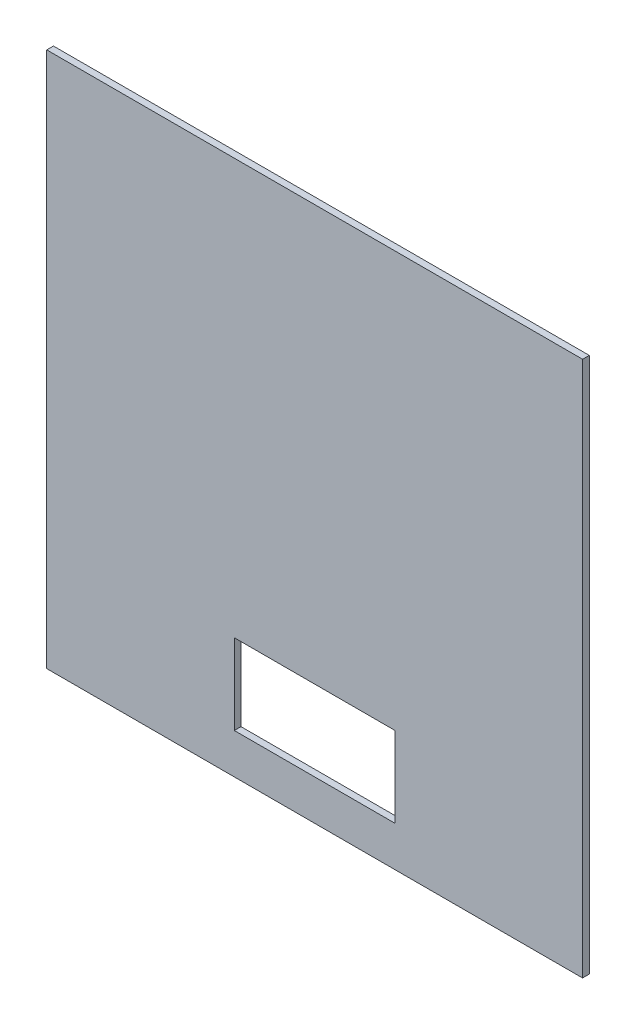
ISO-10303-21;
HEADER;
FILE_DESCRIPTION(('STEP AP214'),'2;1');
FILE_NAME('part.step','',(''),(''),'','','');
FILE_SCHEMA(('AUTOMOTIVE_DESIGN { 1 0 10303 214 1 1 1 1 }'));
ENDSEC;
DATA;
#1=APPLICATION_CONTEXT('core data for automotive mechanical design processes');
#2=APPLICATION_PROTOCOL_DEFINITION('international standard','automotive_design',2000,#1);
#3=PRODUCT_CONTEXT('',#1,'mechanical');
#4=PRODUCT('Part','Part','',(#3));
#5=PRODUCT_RELATED_PRODUCT_CATEGORY('part','',(#4));
#6=PRODUCT_DEFINITION_FORMATION('','',#4);
#7=PRODUCT_DEFINITION_CONTEXT('part definition',#1,'design');
#8=PRODUCT_DEFINITION('design','',#6,#7);
#9=PRODUCT_DEFINITION_SHAPE('','',#8);
#10=(LENGTH_UNIT() NAMED_UNIT(*) SI_UNIT(.MILLI.,.METRE.));
#11=(NAMED_UNIT(*) PLANE_ANGLE_UNIT() SI_UNIT($,.RADIAN.));
#12=(NAMED_UNIT(*) SI_UNIT($,.STERADIAN.) SOLID_ANGLE_UNIT());
#13=UNCERTAINTY_MEASURE_WITH_UNIT(LENGTH_MEASURE(1.E-05),#10,'distance_accuracy_value','');
#14=(GEOMETRIC_REPRESENTATION_CONTEXT(3) GLOBAL_UNCERTAINTY_ASSIGNED_CONTEXT((#13)) GLOBAL_UNIT_ASSIGNED_CONTEXT((#10,
#11,#12)) REPRESENTATION_CONTEXT('',''));
#15=CARTESIAN_POINT('',(0.,0.,0.));
#16=DIRECTION('',(0.,0.,1.));
#17=DIRECTION('',(1.,0.,0.));
#18=AXIS2_PLACEMENT_3D('',#15,#16,#17);
#19=CARTESIAN_POINT('',(0.,-127.,1.5875));
#20=DIRECTION('',(0.,1.,0.));
#21=DIRECTION('',(0.,0.,1.));
#22=AXIS2_PLACEMENT_3D('',#19,#20,#21);
#23=PLANE('',#22);
#24=DIRECTION('',(1.,0.,0.));
#25=VECTOR('',#24,1.);
#26=CARTESIAN_POINT('',(0.,-127.,-1.5875));
#27=LINE('',#26,#25);
#28=CARTESIAN_POINT('',(-127.,-127.,-1.5875));
#29=VERTEX_POINT('',#28);
#30=CARTESIAN_POINT('',(127.,-127.,-1.5875));
#31=VERTEX_POINT('',#30);
#32=EDGE_CURVE('E152',#29,#31,#27,.T.);
#33=ORIENTED_EDGE('',*,*,#32,.T.);
#34=DIRECTION('',(0.,0.,-1.));
#35=VECTOR('',#34,1.);
#36=CARTESIAN_POINT('',(127.,-127.,1.5875));
#37=LINE('',#36,#35);
#38=CARTESIAN_POINT('',(127.,-127.,1.5875));
#39=VERTEX_POINT('',#38);
#40=EDGE_CURVE('E11',#39,#31,#37,.T.);
#41=ORIENTED_EDGE('',*,*,#40,.F.);
#42=DIRECTION('',(1.,0.,0.));
#43=VECTOR('',#42,1.);
#44=CARTESIAN_POINT('',(0.,-127.,1.5875));
#45=LINE('',#44,#43);
#46=CARTESIAN_POINT('',(-127.,-127.,1.5875));
#47=VERTEX_POINT('',#46);
#48=EDGE_CURVE('E124',#47,#39,#45,.T.);
#49=ORIENTED_EDGE('',*,*,#48,.F.);
#50=DIRECTION('',(0.,0.,-1.));
#51=VECTOR('',#50,1.);
#52=CARTESIAN_POINT('',(-127.,-127.,1.5875));
#53=LINE('',#52,#51);
#54=EDGE_CURVE('E64',#47,#29,#53,.T.);
#55=ORIENTED_EDGE('',*,*,#54,.T.);
#56=EDGE_LOOP('',(#33,#41,#49,#55));
#57=FACE_BOUND('',#56,.T.);
#58=ADVANCED_FACE('F45',(#57),#23,.F.);
#59=CARTESIAN_POINT('',(127.,0.,1.5875));
#60=DIRECTION('',(-1.,0.,0.));
#61=DIRECTION('',(0.,0.,1.));
#62=AXIS2_PLACEMENT_3D('',#59,#60,#61);
#63=PLANE('',#62);
#64=DIRECTION('',(0.,1.,0.));
#65=VECTOR('',#64,1.);
#66=CARTESIAN_POINT('',(127.,0.,-1.5875));
#67=LINE('',#66,#65);
#68=CARTESIAN_POINT('',(127.,127.,-1.5875));
#69=VERTEX_POINT('',#68);
#70=EDGE_CURVE('E130',#31,#69,#67,.T.);
#71=ORIENTED_EDGE('',*,*,#70,.T.);
#72=DIRECTION('',(0.,0.,-1.));
#73=VECTOR('',#72,1.);
#74=CARTESIAN_POINT('',(127.,127.,1.5875));
#75=LINE('',#74,#73);
#76=CARTESIAN_POINT('',(127.,127.,1.5875));
#77=VERTEX_POINT('',#76);
#78=EDGE_CURVE('E55',#77,#69,#75,.T.);
#79=ORIENTED_EDGE('',*,*,#78,.F.);
#80=DIRECTION('',(0.,1.,0.));
#81=VECTOR('',#80,1.);
#82=CARTESIAN_POINT('',(127.,0.,1.5875));
#83=LINE('',#82,#81);
#84=EDGE_CURVE('E118',#39,#77,#83,.T.);
#85=ORIENTED_EDGE('',*,*,#84,.F.);
#86=ORIENTED_EDGE('',*,*,#40,.T.);
#87=EDGE_LOOP('',(#71,#79,#85,#86));
#88=FACE_BOUND('',#87,.T.);
#89=ADVANCED_FACE('F129',(#88),#63,.F.);
#90=CARTESIAN_POINT('',(0.,127.,1.5875));
#91=DIRECTION('',(0.,1.,0.));
#92=DIRECTION('',(0.,0.,1.));
#93=AXIS2_PLACEMENT_3D('',#90,#91,#92);
#94=PLANE('',#93);
#95=DIRECTION('',(1.,0.,0.));
#96=VECTOR('',#95,1.);
#97=CARTESIAN_POINT('',(0.,127.,-1.5875));
#98=LINE('',#97,#96);
#99=CARTESIAN_POINT('',(-127.,127.,-1.5875));
#100=VERTEX_POINT('',#99);
#101=EDGE_CURVE('E155',#100,#69,#98,.T.);
#102=ORIENTED_EDGE('',*,*,#101,.F.);
#103=DIRECTION('',(0.,0.,-1.));
#104=VECTOR('',#103,1.);
#105=CARTESIAN_POINT('',(-127.,127.,1.5875));
#106=LINE('',#105,#104);
#107=CARTESIAN_POINT('',(-127.,127.,1.5875));
#108=VERTEX_POINT('',#107);
#109=EDGE_CURVE('E90',#108,#100,#106,.T.);
#110=ORIENTED_EDGE('',*,*,#109,.F.);
#111=DIRECTION('',(1.,0.,0.));
#112=VECTOR('',#111,1.);
#113=CARTESIAN_POINT('',(0.,127.,1.5875));
#114=LINE('',#113,#112);
#115=EDGE_CURVE('E123',#108,#77,#114,.T.);
#116=ORIENTED_EDGE('',*,*,#115,.T.);
#117=ORIENTED_EDGE('',*,*,#78,.T.);
#118=EDGE_LOOP('',(#102,#110,#116,#117));
#119=FACE_BOUND('',#118,.T.);
#120=ADVANCED_FACE('F134',(#119),#94,.T.);
#121=CARTESIAN_POINT('',(38.1,0.,1.5875));
#122=DIRECTION('',(-1.,0.,0.));
#123=DIRECTION('',(0.,0.,1.));
#124=AXIS2_PLACEMENT_3D('',#121,#122,#123);
#125=PLANE('',#124);
#126=DIRECTION('',(0.,1.,0.));
#127=VECTOR('',#126,1.);
#128=CARTESIAN_POINT('',(38.1,0.,-1.5875));
#129=LINE('',#128,#127);
#130=CARTESIAN_POINT('',(38.1,-107.95,-1.5875));
#131=VERTEX_POINT('',#130);
#132=CARTESIAN_POINT('',(38.1,-69.85,-1.5875));
#133=VERTEX_POINT('',#132);
#134=EDGE_CURVE('E141',#131,#133,#129,.T.);
#135=ORIENTED_EDGE('',*,*,#134,.F.);
#136=DIRECTION('',(0.,0.,-1.));
#137=VECTOR('',#136,1.);
#138=CARTESIAN_POINT('',(38.1,-107.95,1.5875));
#139=LINE('',#138,#137);
#140=CARTESIAN_POINT('',(38.1,-107.95,1.5875));
#141=VERTEX_POINT('',#140);
#142=EDGE_CURVE('E49',#141,#131,#139,.T.);
#143=ORIENTED_EDGE('',*,*,#142,.F.);
#144=DIRECTION('',(0.,1.,0.));
#145=VECTOR('',#144,1.);
#146=CARTESIAN_POINT('',(38.1,0.,1.5875));
#147=LINE('',#146,#145);
#148=CARTESIAN_POINT('',(38.1,-69.85,1.5875));
#149=VERTEX_POINT('',#148);
#150=EDGE_CURVE('E160',#141,#149,#147,.T.);
#151=ORIENTED_EDGE('',*,*,#150,.T.);
#152=DIRECTION('',(0.,0.,-1.));
#153=VECTOR('',#152,1.);
#154=CARTESIAN_POINT('',(38.1,-69.85,1.5875));
#155=LINE('',#154,#153);
#156=EDGE_CURVE('E137',#149,#133,#155,.T.);
#157=ORIENTED_EDGE('',*,*,#156,.T.);
#158=EDGE_LOOP('',(#135,#143,#151,#157));
#159=FACE_BOUND('',#158,.T.);
#160=ADVANCED_FACE('F47',(#159),#125,.T.);
#161=CARTESIAN_POINT('',(0.,-107.95,1.5875));
#162=DIRECTION('',(0.,1.,0.));
#163=DIRECTION('',(0.,0.,1.));
#164=AXIS2_PLACEMENT_3D('',#161,#162,#163);
#165=PLANE('',#164);
#166=DIRECTION('',(1.,0.,0.));
#167=VECTOR('',#166,1.);
#168=CARTESIAN_POINT('',(0.,-107.95,-1.5875));
#169=LINE('',#168,#167);
#170=CARTESIAN_POINT('',(-38.1,-107.95,-1.5875));
#171=VERTEX_POINT('',#170);
#172=EDGE_CURVE('E144',#171,#131,#169,.T.);
#173=ORIENTED_EDGE('',*,*,#172,.F.);
#174=DIRECTION('',(0.,0.,-1.));
#175=VECTOR('',#174,1.);
#176=CARTESIAN_POINT('',(-38.1,-107.95,1.5875));
#177=LINE('',#176,#175);
#178=CARTESIAN_POINT('',(-38.1,-107.95,1.5875));
#179=VERTEX_POINT('',#178);
#180=EDGE_CURVE('E166',#179,#171,#177,.T.);
#181=ORIENTED_EDGE('',*,*,#180,.F.);
#182=DIRECTION('',(1.,0.,0.));
#183=VECTOR('',#182,1.);
#184=CARTESIAN_POINT('',(0.,-107.95,1.5875));
#185=LINE('',#184,#183);
#186=EDGE_CURVE('E175',#179,#141,#185,.T.);
#187=ORIENTED_EDGE('',*,*,#186,.T.);
#188=ORIENTED_EDGE('',*,*,#142,.T.);
#189=EDGE_LOOP('',(#173,#181,#187,#188));
#190=FACE_BOUND('',#189,.T.);
#191=ADVANCED_FACE('F173',(#190),#165,.T.);
#192=CARTESIAN_POINT('',(-38.1,0.,1.5875));
#193=DIRECTION('',(-1.,0.,0.));
#194=DIRECTION('',(0.,0.,1.));
#195=AXIS2_PLACEMENT_3D('',#192,#193,#194);
#196=PLANE('',#195);
#197=DIRECTION('',(0.,1.,0.));
#198=VECTOR('',#197,1.);
#199=CARTESIAN_POINT('',(-38.1,0.,-1.5875));
#200=LINE('',#199,#198);
#201=CARTESIAN_POINT('',(-38.1,-69.85,-1.5875));
#202=VERTEX_POINT('',#201);
#203=EDGE_CURVE('E147',#171,#202,#200,.T.);
#204=ORIENTED_EDGE('',*,*,#203,.T.);
#205=DIRECTION('',(0.,0.,-1.));
#206=VECTOR('',#205,1.);
#207=CARTESIAN_POINT('',(-38.1,-69.85,1.5875));
#208=LINE('',#207,#206);
#209=CARTESIAN_POINT('',(-38.1,-69.85,1.5875));
#210=VERTEX_POINT('',#209);
#211=EDGE_CURVE('E164',#210,#202,#208,.T.);
#212=ORIENTED_EDGE('',*,*,#211,.F.);
#213=DIRECTION('',(0.,1.,0.));
#214=VECTOR('',#213,1.);
#215=CARTESIAN_POINT('',(-38.1,0.,1.5875));
#216=LINE('',#215,#214);
#217=EDGE_CURVE('E188',#179,#210,#216,.T.);
#218=ORIENTED_EDGE('',*,*,#217,.F.);
#219=ORIENTED_EDGE('',*,*,#180,.T.);
#220=EDGE_LOOP('',(#204,#212,#218,#219));
#221=FACE_BOUND('',#220,.T.);
#222=ADVANCED_FACE('F182',(#221),#196,.F.);
#223=CARTESIAN_POINT('',(0.,-69.85,1.5875));
#224=DIRECTION('',(0.,1.,0.));
#225=DIRECTION('',(0.,0.,1.));
#226=AXIS2_PLACEMENT_3D('',#223,#224,#225);
#227=PLANE('',#226);
#228=DIRECTION('',(1.,0.,0.));
#229=VECTOR('',#228,1.);
#230=CARTESIAN_POINT('',(0.,-69.85,-1.5875));
#231=LINE('',#230,#229);
#232=EDGE_CURVE('E149',#202,#133,#231,.T.);
#233=ORIENTED_EDGE('',*,*,#232,.T.);
#234=ORIENTED_EDGE('',*,*,#156,.F.);
#235=DIRECTION('',(1.,0.,0.));
#236=VECTOR('',#235,1.);
#237=CARTESIAN_POINT('',(0.,-69.85,1.5875));
#238=LINE('',#237,#236);
#239=EDGE_CURVE('E186',#210,#149,#238,.T.);
#240=ORIENTED_EDGE('',*,*,#239,.F.);
#241=ORIENTED_EDGE('',*,*,#211,.T.);
#242=EDGE_LOOP('',(#233,#234,#240,#241));
#243=FACE_BOUND('',#242,.T.);
#244=ADVANCED_FACE('F185',(#243),#227,.F.);
#245=CARTESIAN_POINT('',(-127.,0.,1.5875));
#246=DIRECTION('',(-1.,0.,0.));
#247=DIRECTION('',(0.,0.,1.));
#248=AXIS2_PLACEMENT_3D('',#245,#246,#247);
#249=PLANE('',#248);
#250=DIRECTION('',(0.,1.,0.));
#251=VECTOR('',#250,1.);
#252=CARTESIAN_POINT('',(-127.,0.,-1.5875));
#253=LINE('',#252,#251);
#254=EDGE_CURVE('E157',#29,#100,#253,.T.);
#255=ORIENTED_EDGE('',*,*,#254,.F.);
#256=ORIENTED_EDGE('',*,*,#54,.F.);
#257=DIRECTION('',(0.,1.,0.));
#258=VECTOR('',#257,1.);
#259=CARTESIAN_POINT('',(-127.,0.,1.5875));
#260=LINE('',#259,#258);
#261=EDGE_CURVE('E135',#47,#108,#260,.T.);
#262=ORIENTED_EDGE('',*,*,#261,.T.);
#263=ORIENTED_EDGE('',*,*,#109,.T.);
#264=EDGE_LOOP('',(#255,#256,#262,#263));
#265=FACE_BOUND('',#264,.T.);
#266=ADVANCED_FACE('F194',(#265),#249,.T.);
#267=CARTESIAN_POINT('',(0.,0.,1.5875));
#268=DIRECTION('',(0.,0.,1.));
#269=DIRECTION('',(1.,0.,0.));
#270=AXIS2_PLACEMENT_3D('',#267,#268,#269);
#271=PLANE('',#270);
#272=ORIENTED_EDGE('',*,*,#150,.F.);
#273=ORIENTED_EDGE('',*,*,#186,.F.);
#274=ORIENTED_EDGE('',*,*,#217,.T.);
#275=ORIENTED_EDGE('',*,*,#239,.T.);
#276=EDGE_LOOP('',(#272,#273,#274,#275));
#277=FACE_BOUND('',#276,.T.);
#278=ORIENTED_EDGE('',*,*,#48,.T.);
#279=ORIENTED_EDGE('',*,*,#84,.T.);
#280=ORIENTED_EDGE('',*,*,#115,.F.);
#281=ORIENTED_EDGE('',*,*,#261,.F.);
#282=EDGE_LOOP('',(#278,#279,#280,#281));
#283=FACE_BOUND('',#282,.T.);
#284=ADVANCED_FACE('F120',(#277,#283),#271,.T.);
#285=CARTESIAN_POINT('',(0.,0.,-1.5875));
#286=DIRECTION('',(0.,0.,1.));
#287=DIRECTION('',(1.,0.,0.));
#288=AXIS2_PLACEMENT_3D('',#285,#286,#287);
#289=PLANE('',#288);
#290=ORIENTED_EDGE('',*,*,#134,.T.);
#291=ORIENTED_EDGE('',*,*,#232,.F.);
#292=ORIENTED_EDGE('',*,*,#203,.F.);
#293=ORIENTED_EDGE('',*,*,#172,.T.);
#294=EDGE_LOOP('',(#290,#291,#292,#293));
#295=FACE_BOUND('',#294,.T.);
#296=ORIENTED_EDGE('',*,*,#32,.F.);
#297=ORIENTED_EDGE('',*,*,#254,.T.);
#298=ORIENTED_EDGE('',*,*,#101,.T.);
#299=ORIENTED_EDGE('',*,*,#70,.F.);
#300=EDGE_LOOP('',(#296,#297,#298,#299));
#301=FACE_BOUND('',#300,.T.);
#302=ADVANCED_FACE('F179',(#295,#301),#289,.F.);
#303=CLOSED_SHELL('',(#58,#89,#120,#160,#191,#222,#244,#266,#284,#302));
#304=MANIFOLD_SOLID_BREP('B2',#303);
#305=ADVANCED_BREP_SHAPE_REPRESENTATION('',(#18,#304),#14);
#306=SHAPE_DEFINITION_REPRESENTATION(#9,#305);
ENDSEC;
END-ISO-10303-21;
